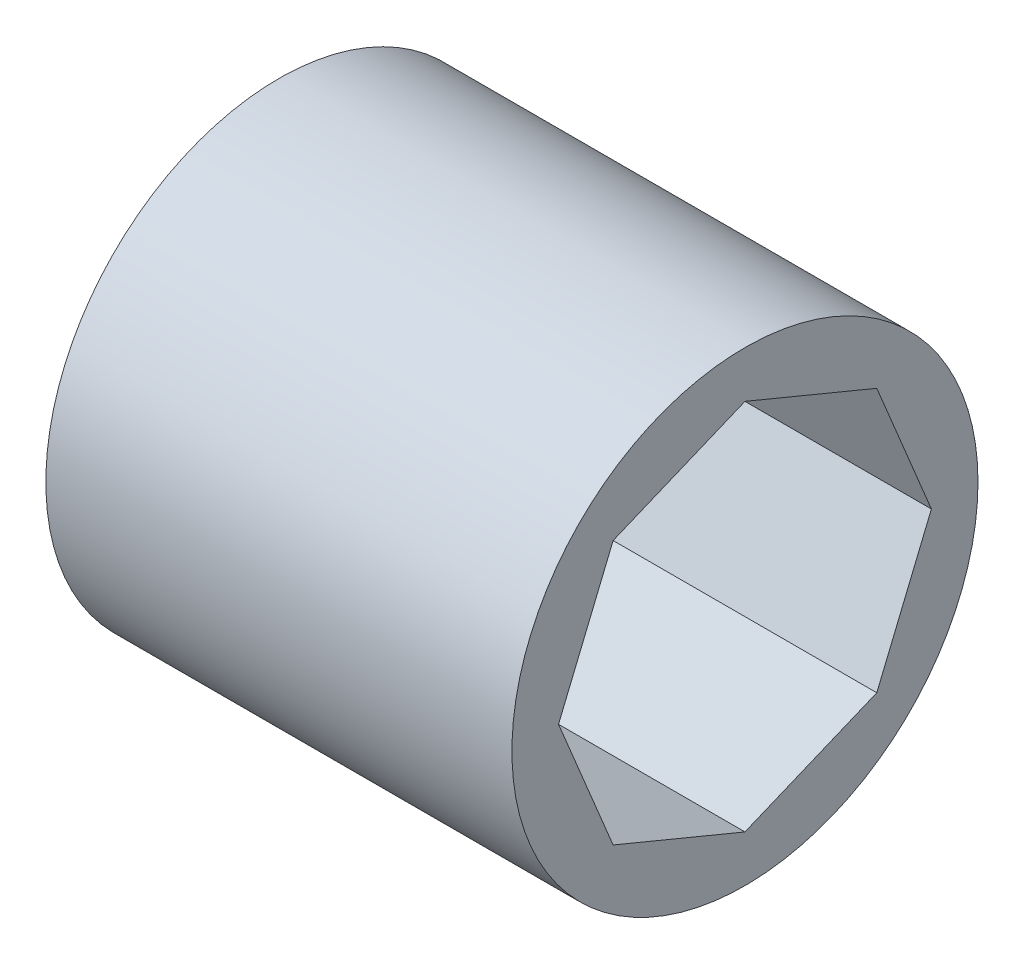
ISO-10303-21;
HEADER;
FILE_DESCRIPTION(('STEP AP214'),'2;1');
FILE_NAME('part.step','',(''),(''),'','','');
FILE_SCHEMA(('AUTOMOTIVE_DESIGN { 1 0 10303 214 1 1 1 1 }'));
ENDSEC;
DATA;
#1=APPLICATION_CONTEXT('core data for automotive mechanical design processes');
#2=APPLICATION_PROTOCOL_DEFINITION('international standard','automotive_design',2000,#1);
#3=PRODUCT_CONTEXT('',#1,'mechanical');
#4=PRODUCT('Part','Part','',(#3));
#5=PRODUCT_RELATED_PRODUCT_CATEGORY('part','',(#4));
#6=PRODUCT_DEFINITION_FORMATION('','',#4);
#7=PRODUCT_DEFINITION_CONTEXT('part definition',#1,'design');
#8=PRODUCT_DEFINITION('design','',#6,#7);
#9=PRODUCT_DEFINITION_SHAPE('','',#8);
#10=(LENGTH_UNIT() NAMED_UNIT(*) SI_UNIT(.MILLI.,.METRE.));
#11=(NAMED_UNIT(*) PLANE_ANGLE_UNIT() SI_UNIT($,.RADIAN.));
#12=(NAMED_UNIT(*) SI_UNIT($,.STERADIAN.) SOLID_ANGLE_UNIT());
#13=UNCERTAINTY_MEASURE_WITH_UNIT(LENGTH_MEASURE(1.E-05),#10,'distance_accuracy_value','');
#14=(GEOMETRIC_REPRESENTATION_CONTEXT(3) GLOBAL_UNCERTAINTY_ASSIGNED_CONTEXT((#13)) GLOBAL_UNIT_ASSIGNED_CONTEXT((#10,
#11,#12)) REPRESENTATION_CONTEXT('',''));
#15=CARTESIAN_POINT('',(0.,0.,0.));
#16=DIRECTION('',(0.,0.,1.));
#17=DIRECTION('',(1.,0.,0.));
#18=AXIS2_PLACEMENT_3D('',#15,#16,#17);
#19=CARTESIAN_POINT('',(20.,0.,0.));
#20=DIRECTION('',(-1.,0.,0.));
#21=DIRECTION('',(0.,0.,1.));
#22=AXIS2_PLACEMENT_3D('',#19,#20,#21);
#23=CYLINDRICAL_SURFACE('',#22,10.);
#24=CARTESIAN_POINT('',(20.,0.,0.));
#25=DIRECTION('',(1.,0.,0.));
#26=DIRECTION('',(0.,0.,-1.));
#27=AXIS2_PLACEMENT_3D('',#24,#25,#26);
#28=CIRCLE('',#27,10.);
#29=CARTESIAN_POINT('',(20.,0.,-10.));
#30=VERTEX_POINT('',#29);
#31=EDGE_CURVE('E11',#30,#30,#28,.T.);
#32=ORIENTED_EDGE('',*,*,#31,.F.);
#33=EDGE_LOOP('',(#32));
#34=FACE_BOUND('',#33,.T.);
#35=CARTESIAN_POINT('',(0.,0.,0.));
#36=DIRECTION('',(1.,0.,0.));
#37=DIRECTION('',(0.,0.,-1.));
#38=AXIS2_PLACEMENT_3D('',#35,#36,#37);
#39=CIRCLE('',#38,10.);
#40=CARTESIAN_POINT('',(0.,0.,-10.));
#41=VERTEX_POINT('',#40);
#42=EDGE_CURVE('E41',#41,#41,#39,.T.);
#43=ORIENTED_EDGE('',*,*,#42,.T.);
#44=EDGE_LOOP('',(#43));
#45=FACE_BOUND('',#44,.T.);
#46=ADVANCED_FACE('F38',(#34,#45),#23,.T.);
#47=CARTESIAN_POINT('',(20.,0.,0.));
#48=DIRECTION('',(1.,0.,0.));
#49=DIRECTION('',(0.,0.,-1.));
#50=AXIS2_PLACEMENT_3D('',#47,#48,#49);
#51=PLANE('',#50);
#52=DIRECTION('',(0.,0.923879532511291,-0.382683432365079));
#53=VECTOR('',#52,1.);
#54=CARTESIAN_POINT('',(20.,-5.65685424949232,-5.65685424949244));
#55=LINE('',#54,#53);
#56=CARTESIAN_POINT('',(20.,-5.65685424949232,-5.65685424949244));
#57=VERTEX_POINT('',#56);
#58=CARTESIAN_POINT('',(20.,0.,-8.));
#59=VERTEX_POINT('',#58);
#60=EDGE_CURVE('E53',#57,#59,#55,.T.);
#61=ORIENTED_EDGE('',*,*,#60,.F.);
#62=DIRECTION('',(0.,0.3826834323651,-0.923879532511283));
#63=VECTOR('',#62,1.);
#64=CARTESIAN_POINT('',(20.,-8.,0.));
#65=LINE('',#64,#63);
#66=CARTESIAN_POINT('',(20.,-8.,0.));
#67=VERTEX_POINT('',#66);
#68=EDGE_CURVE('E125',#67,#57,#65,.T.);
#69=ORIENTED_EDGE('',*,*,#68,.F.);
#70=DIRECTION('',(0.,-0.382683432365079,-0.923879532511291));
#71=VECTOR('',#70,1.);
#72=CARTESIAN_POINT('',(20.,-5.65685424949244,5.65685424949232));
#73=LINE('',#72,#71);
#74=CARTESIAN_POINT('',(20.,-5.65685424949244,5.65685424949232));
#75=VERTEX_POINT('',#74);
#76=EDGE_CURVE('E129',#75,#67,#73,.T.);
#77=ORIENTED_EDGE('',*,*,#76,.F.);
#78=DIRECTION('',(0.,-0.923879532511283,-0.3826834323651));
#79=VECTOR('',#78,1.);
#80=CARTESIAN_POINT('',(20.,0.,8.));
#81=LINE('',#80,#79);
#82=CARTESIAN_POINT('',(20.,0.,8.));
#83=VERTEX_POINT('',#82);
#84=EDGE_CURVE('E168',#83,#75,#81,.T.);
#85=ORIENTED_EDGE('',*,*,#84,.F.);
#86=DIRECTION('',(0.,-0.923879532511291,0.382683432365079));
#87=VECTOR('',#86,1.);
#88=CARTESIAN_POINT('',(20.,5.65685424949232,5.65685424949244));
#89=LINE('',#88,#87);
#90=CARTESIAN_POINT('',(20.,5.65685424949232,5.65685424949244));
#91=VERTEX_POINT('',#90);
#92=EDGE_CURVE('E164',#91,#83,#89,.T.);
#93=ORIENTED_EDGE('',*,*,#92,.F.);
#94=DIRECTION('',(0.,-0.3826834323651,0.923879532511283));
#95=VECTOR('',#94,1.);
#96=CARTESIAN_POINT('',(20.,8.,0.));
#97=LINE('',#96,#95);
#98=CARTESIAN_POINT('',(20.,8.,0.));
#99=VERTEX_POINT('',#98);
#100=EDGE_CURVE('E160',#99,#91,#97,.T.);
#101=ORIENTED_EDGE('',*,*,#100,.F.);
#102=DIRECTION('',(0.,0.382683432365079,0.923879532511291));
#103=VECTOR('',#102,1.);
#104=CARTESIAN_POINT('',(20.,5.65685424949244,-5.65685424949232));
#105=LINE('',#104,#103);
#106=CARTESIAN_POINT('',(20.,5.65685424949244,-5.65685424949232));
#107=VERTEX_POINT('',#106);
#108=EDGE_CURVE('E156',#107,#99,#105,.T.);
#109=ORIENTED_EDGE('',*,*,#108,.F.);
#110=DIRECTION('',(0.,0.923879532511282,0.3826834323651));
#111=VECTOR('',#110,1.);
#112=CARTESIAN_POINT('',(20.,0.,-8.));
#113=LINE('',#112,#111);
#114=EDGE_CURVE('E153',#59,#107,#113,.T.);
#115=ORIENTED_EDGE('',*,*,#114,.F.);
#116=EDGE_LOOP('',(#61,#69,#77,#85,#93,#101,#109,#115));
#117=FACE_BOUND('',#116,.T.);
#118=ORIENTED_EDGE('',*,*,#31,.T.);
#119=EDGE_LOOP('',(#118));
#120=FACE_BOUND('',#119,.T.);
#121=ADVANCED_FACE('F198',(#117,#120),#51,.T.);
#122=CARTESIAN_POINT('',(0.,0.,0.));
#123=DIRECTION('',(1.,0.,0.));
#124=DIRECTION('',(0.,0.,-1.));
#125=AXIS2_PLACEMENT_3D('',#122,#123,#124);
#126=PLANE('',#125);
#127=DIRECTION('',(0.,0.3826834323651,-0.923879532511283));
#128=VECTOR('',#127,1.);
#129=CARTESIAN_POINT('',(0.,-8.,0.));
#130=LINE('',#129,#128);
#131=CARTESIAN_POINT('',(0.,-8.,0.));
#132=VERTEX_POINT('',#131);
#133=CARTESIAN_POINT('',(0.,-5.65685424949232,-5.65685424949244));
#134=VERTEX_POINT('',#133);
#135=EDGE_CURVE('E112',#132,#134,#130,.T.);
#136=ORIENTED_EDGE('',*,*,#135,.T.);
#137=DIRECTION('',(0.,0.923879532511291,-0.382683432365079));
#138=VECTOR('',#137,1.);
#139=CARTESIAN_POINT('',(0.,-5.65685424949232,-5.65685424949244));
#140=LINE('',#139,#138);
#141=CARTESIAN_POINT('',(0.,0.,-8.));
#142=VERTEX_POINT('',#141);
#143=EDGE_CURVE('E105',#134,#142,#140,.T.);
#144=ORIENTED_EDGE('',*,*,#143,.T.);
#145=DIRECTION('',(0.,0.923879532511282,0.3826834323651));
#146=VECTOR('',#145,1.);
#147=CARTESIAN_POINT('',(0.,0.,-8.));
#148=LINE('',#147,#146);
#149=CARTESIAN_POINT('',(0.,5.65685424949244,-5.65685424949232));
#150=VERTEX_POINT('',#149);
#151=EDGE_CURVE('E115',#142,#150,#148,.T.);
#152=ORIENTED_EDGE('',*,*,#151,.T.);
#153=DIRECTION('',(0.,0.382683432365079,0.923879532511291));
#154=VECTOR('',#153,1.);
#155=CARTESIAN_POINT('',(0.,5.65685424949244,-5.65685424949232));
#156=LINE('',#155,#154);
#157=CARTESIAN_POINT('',(0.,8.,0.));
#158=VERTEX_POINT('',#157);
#159=EDGE_CURVE('E61',#150,#158,#156,.T.);
#160=ORIENTED_EDGE('',*,*,#159,.T.);
#161=DIRECTION('',(0.,-0.3826834323651,0.923879532511283));
#162=VECTOR('',#161,1.);
#163=CARTESIAN_POINT('',(0.,8.,0.));
#164=LINE('',#163,#162);
#165=CARTESIAN_POINT('',(0.,5.65685424949232,5.65685424949244));
#166=VERTEX_POINT('',#165);
#167=EDGE_CURVE('E134',#158,#166,#164,.T.);
#168=ORIENTED_EDGE('',*,*,#167,.T.);
#169=DIRECTION('',(0.,-0.923879532511291,0.382683432365079));
#170=VECTOR('',#169,1.);
#171=CARTESIAN_POINT('',(0.,5.65685424949232,5.65685424949244));
#172=LINE('',#171,#170);
#173=CARTESIAN_POINT('',(0.,0.,8.));
#174=VERTEX_POINT('',#173);
#175=EDGE_CURVE('E138',#166,#174,#172,.T.);
#176=ORIENTED_EDGE('',*,*,#175,.T.);
#177=DIRECTION('',(0.,-0.923879532511283,-0.3826834323651));
#178=VECTOR('',#177,1.);
#179=CARTESIAN_POINT('',(0.,0.,8.));
#180=LINE('',#179,#178);
#181=CARTESIAN_POINT('',(0.,-5.65685424949244,5.65685424949232));
#182=VERTEX_POINT('',#181);
#183=EDGE_CURVE('E142',#174,#182,#180,.T.);
#184=ORIENTED_EDGE('',*,*,#183,.T.);
#185=DIRECTION('',(0.,-0.382683432365079,-0.923879532511291));
#186=VECTOR('',#185,1.);
#187=CARTESIAN_POINT('',(0.,-5.65685424949244,5.65685424949232));
#188=LINE('',#187,#186);
#189=EDGE_CURVE('E146',#182,#132,#188,.T.);
#190=ORIENTED_EDGE('',*,*,#189,.T.);
#191=EDGE_LOOP('',(#136,#144,#152,#160,#168,#176,#184,#190));
#192=FACE_BOUND('',#191,.T.);
#193=ORIENTED_EDGE('',*,*,#42,.F.);
#194=EDGE_LOOP('',(#193));
#195=FACE_BOUND('',#194,.T.);
#196=ADVANCED_FACE('F120',(#192,#195),#126,.F.);
#197=CARTESIAN_POINT('',(0.,-5.65685424949232,-5.65685424949244));
#198=DIRECTION('',(0.,-0.382683432365079,-0.923879532511291));
#199=DIRECTION('',(0.,0.923879532511291,-0.382683432365079));
#200=AXIS2_PLACEMENT_3D('',#197,#198,#199);
#201=PLANE('',#200);
#202=ORIENTED_EDGE('',*,*,#60,.T.);
#203=DIRECTION('',(1.,0.,0.));
#204=VECTOR('',#203,1.);
#205=CARTESIAN_POINT('',(0.,0.,-8.));
#206=LINE('',#205,#204);
#207=EDGE_CURVE('E101',#142,#59,#206,.T.);
#208=ORIENTED_EDGE('',*,*,#207,.F.);
#209=ORIENTED_EDGE('',*,*,#143,.F.);
#210=DIRECTION('',(1.,0.,0.));
#211=VECTOR('',#210,1.);
#212=CARTESIAN_POINT('',(0.,-5.65685424949232,-5.65685424949244));
#213=LINE('',#212,#211);
#214=EDGE_CURVE('E175',#134,#57,#213,.T.);
#215=ORIENTED_EDGE('',*,*,#214,.T.);
#216=EDGE_LOOP('',(#202,#208,#209,#215));
#217=FACE_BOUND('',#216,.T.);
#218=ADVANCED_FACE('F103',(#217),#201,.F.);
#219=CARTESIAN_POINT('',(0.,-8.,0.));
#220=DIRECTION('',(0.,-0.923879532511283,-0.3826834323651));
#221=DIRECTION('',(0.,0.3826834323651,-0.923879532511283));
#222=AXIS2_PLACEMENT_3D('',#219,#220,#221);
#223=PLANE('',#222);
#224=ORIENTED_EDGE('',*,*,#68,.T.);
#225=ORIENTED_EDGE('',*,*,#214,.F.);
#226=ORIENTED_EDGE('',*,*,#135,.F.);
#227=DIRECTION('',(1.,0.,0.));
#228=VECTOR('',#227,1.);
#229=CARTESIAN_POINT('',(0.,-8.,0.));
#230=LINE('',#229,#228);
#231=EDGE_CURVE('E178',#132,#67,#230,.T.);
#232=ORIENTED_EDGE('',*,*,#231,.T.);
#233=EDGE_LOOP('',(#224,#225,#226,#232));
#234=FACE_BOUND('',#233,.T.);
#235=ADVANCED_FACE('F217',(#234),#223,.F.);
#236=CARTESIAN_POINT('',(0.,-5.65685424949244,5.65685424949232));
#237=DIRECTION('',(0.,-0.923879532511291,0.382683432365079));
#238=DIRECTION('',(0.,-0.382683432365079,-0.923879532511291));
#239=AXIS2_PLACEMENT_3D('',#236,#237,#238);
#240=PLANE('',#239);
#241=ORIENTED_EDGE('',*,*,#76,.T.);
#242=ORIENTED_EDGE('',*,*,#231,.F.);
#243=ORIENTED_EDGE('',*,*,#189,.F.);
#244=DIRECTION('',(1.,0.,0.));
#245=VECTOR('',#244,1.);
#246=CARTESIAN_POINT('',(0.,-5.65685424949244,5.65685424949232));
#247=LINE('',#246,#245);
#248=EDGE_CURVE('E181',#182,#75,#247,.T.);
#249=ORIENTED_EDGE('',*,*,#248,.T.);
#250=EDGE_LOOP('',(#241,#242,#243,#249));
#251=FACE_BOUND('',#250,.T.);
#252=ADVANCED_FACE('F214',(#251),#240,.F.);
#253=CARTESIAN_POINT('',(0.,0.,8.));
#254=DIRECTION('',(0.,-0.3826834323651,0.923879532511283));
#255=DIRECTION('',(0.,-0.923879532511283,-0.3826834323651));
#256=AXIS2_PLACEMENT_3D('',#253,#254,#255);
#257=PLANE('',#256);
#258=ORIENTED_EDGE('',*,*,#84,.T.);
#259=ORIENTED_EDGE('',*,*,#248,.F.);
#260=ORIENTED_EDGE('',*,*,#183,.F.);
#261=DIRECTION('',(1.,0.,0.));
#262=VECTOR('',#261,1.);
#263=CARTESIAN_POINT('',(0.,0.,8.));
#264=LINE('',#263,#262);
#265=EDGE_CURVE('E184',#174,#83,#264,.T.);
#266=ORIENTED_EDGE('',*,*,#265,.T.);
#267=EDGE_LOOP('',(#258,#259,#260,#266));
#268=FACE_BOUND('',#267,.T.);
#269=ADVANCED_FACE('F210',(#268),#257,.F.);
#270=CARTESIAN_POINT('',(0.,5.65685424949232,5.65685424949244));
#271=DIRECTION('',(0.,0.382683432365079,0.923879532511291));
#272=DIRECTION('',(0.,-0.923879532511291,0.382683432365079));
#273=AXIS2_PLACEMENT_3D('',#270,#271,#272);
#274=PLANE('',#273);
#275=ORIENTED_EDGE('',*,*,#92,.T.);
#276=ORIENTED_EDGE('',*,*,#265,.F.);
#277=ORIENTED_EDGE('',*,*,#175,.F.);
#278=DIRECTION('',(1.,0.,0.));
#279=VECTOR('',#278,1.);
#280=CARTESIAN_POINT('',(0.,5.65685424949232,5.65685424949244));
#281=LINE('',#280,#279);
#282=EDGE_CURVE('E187',#166,#91,#281,.T.);
#283=ORIENTED_EDGE('',*,*,#282,.T.);
#284=EDGE_LOOP('',(#275,#276,#277,#283));
#285=FACE_BOUND('',#284,.T.);
#286=ADVANCED_FACE('F208',(#285),#274,.F.);
#287=CARTESIAN_POINT('',(0.,8.,0.));
#288=DIRECTION('',(0.,0.923879532511283,0.3826834323651));
#289=DIRECTION('',(0.,-0.3826834323651,0.923879532511283));
#290=AXIS2_PLACEMENT_3D('',#287,#288,#289);
#291=PLANE('',#290);
#292=ORIENTED_EDGE('',*,*,#100,.T.);
#293=ORIENTED_EDGE('',*,*,#282,.F.);
#294=ORIENTED_EDGE('',*,*,#167,.F.);
#295=DIRECTION('',(1.,0.,0.));
#296=VECTOR('',#295,1.);
#297=CARTESIAN_POINT('',(0.,8.,0.));
#298=LINE('',#297,#296);
#299=EDGE_CURVE('E190',#158,#99,#298,.T.);
#300=ORIENTED_EDGE('',*,*,#299,.T.);
#301=EDGE_LOOP('',(#292,#293,#294,#300));
#302=FACE_BOUND('',#301,.T.);
#303=ADVANCED_FACE('F203',(#302),#291,.F.);
#304=CARTESIAN_POINT('',(0.,5.65685424949244,-5.65685424949232));
#305=DIRECTION('',(0.,0.923879532511291,-0.382683432365079));
#306=DIRECTION('',(0.,0.382683432365079,0.923879532511291));
#307=AXIS2_PLACEMENT_3D('',#304,#305,#306);
#308=PLANE('',#307);
#309=ORIENTED_EDGE('',*,*,#108,.T.);
#310=ORIENTED_EDGE('',*,*,#299,.F.);
#311=ORIENTED_EDGE('',*,*,#159,.F.);
#312=DIRECTION('',(1.,0.,0.));
#313=VECTOR('',#312,1.);
#314=CARTESIAN_POINT('',(0.,5.65685424949244,-5.65685424949232));
#315=LINE('',#314,#313);
#316=EDGE_CURVE('E111',#150,#107,#315,.T.);
#317=ORIENTED_EDGE('',*,*,#316,.T.);
#318=EDGE_LOOP('',(#309,#310,#311,#317));
#319=FACE_BOUND('',#318,.T.);
#320=ADVANCED_FACE('F194',(#319),#308,.F.);
#321=CARTESIAN_POINT('',(0.,0.,-8.));
#322=DIRECTION('',(0.,0.3826834323651,-0.923879532511283));
#323=DIRECTION('',(0.,0.923879532511283,0.3826834323651));
#324=AXIS2_PLACEMENT_3D('',#321,#322,#323);
#325=PLANE('',#324);
#326=ORIENTED_EDGE('',*,*,#114,.T.);
#327=ORIENTED_EDGE('',*,*,#316,.F.);
#328=ORIENTED_EDGE('',*,*,#151,.F.);
#329=ORIENTED_EDGE('',*,*,#207,.T.);
#330=EDGE_LOOP('',(#326,#327,#328,#329));
#331=FACE_BOUND('',#330,.T.);
#332=ADVANCED_FACE('F116',(#331),#325,.F.);
#333=CLOSED_SHELL('',(#46,#121,#196,#218,#235,#252,#269,#286,#303,#320,#332));
#334=MANIFOLD_SOLID_BREP('B2',#333);
#335=ADVANCED_BREP_SHAPE_REPRESENTATION('',(#18,#334),#14);
#336=SHAPE_DEFINITION_REPRESENTATION(#9,#335);
ENDSEC;
END-ISO-10303-21;
